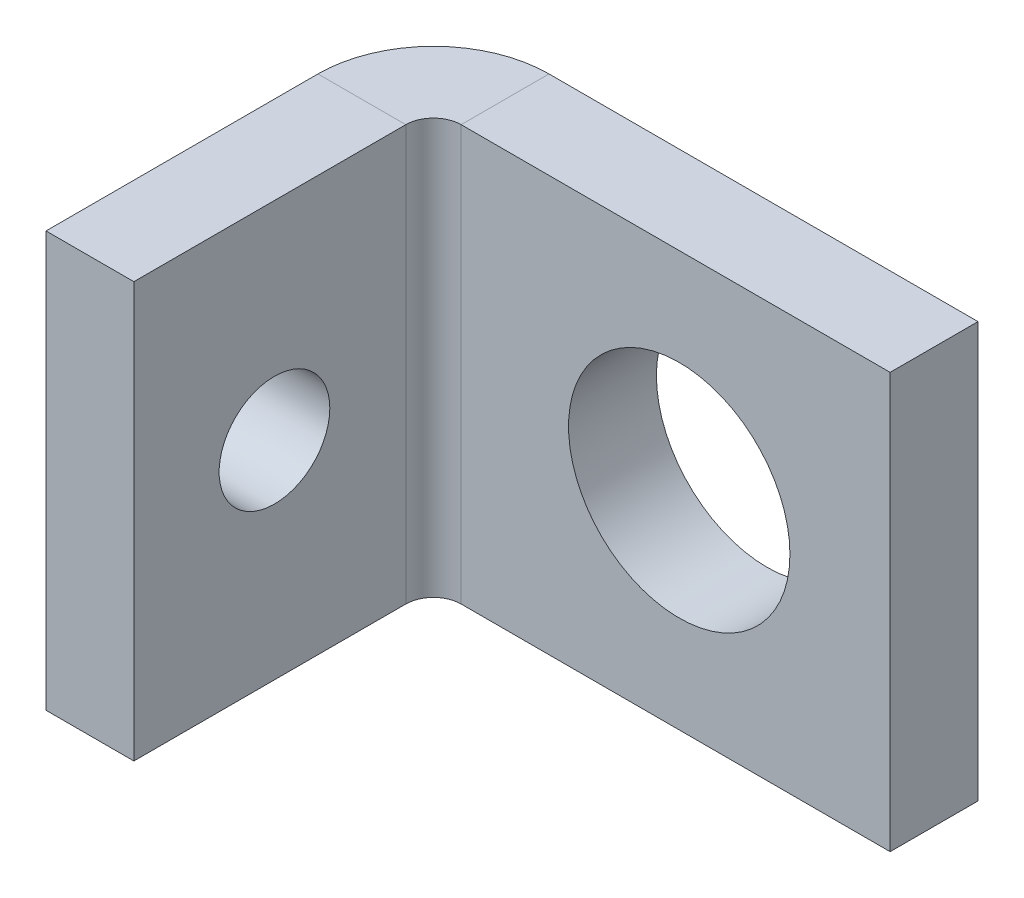
ISO-10303-21;
HEADER;
FILE_DESCRIPTION(('STEP AP214'),'2;1');
FILE_NAME('part.step','',(''),(''),'','','');
FILE_SCHEMA(('AUTOMOTIVE_DESIGN { 1 0 10303 214 1 1 1 1 }'));
ENDSEC;
DATA;
#1=APPLICATION_CONTEXT('core data for automotive mechanical design processes');
#2=APPLICATION_PROTOCOL_DEFINITION('international standard','automotive_design',2000,#1);
#3=PRODUCT_CONTEXT('',#1,'mechanical');
#4=PRODUCT('Part','Part','',(#3));
#5=PRODUCT_RELATED_PRODUCT_CATEGORY('part','',(#4));
#6=PRODUCT_DEFINITION_FORMATION('','',#4);
#7=PRODUCT_DEFINITION_CONTEXT('part definition',#1,'design');
#8=PRODUCT_DEFINITION('design','',#6,#7);
#9=PRODUCT_DEFINITION_SHAPE('','',#8);
#10=(LENGTH_UNIT() NAMED_UNIT(*) SI_UNIT(.MILLI.,.METRE.));
#11=(NAMED_UNIT(*) PLANE_ANGLE_UNIT() SI_UNIT($,.RADIAN.));
#12=(NAMED_UNIT(*) SI_UNIT($,.STERADIAN.) SOLID_ANGLE_UNIT());
#13=UNCERTAINTY_MEASURE_WITH_UNIT(LENGTH_MEASURE(1.E-05),#10,'distance_accuracy_value','');
#14=(GEOMETRIC_REPRESENTATION_CONTEXT(3) GLOBAL_UNCERTAINTY_ASSIGNED_CONTEXT((#13)) GLOBAL_UNIT_ASSIGNED_CONTEXT((#10,
#11,#12)) REPRESENTATION_CONTEXT('',''));
#15=CARTESIAN_POINT('',(0.,0.,0.));
#16=DIRECTION('',(0.,0.,1.));
#17=DIRECTION('',(1.,0.,0.));
#18=AXIS2_PLACEMENT_3D('',#15,#16,#17);
#19=CARTESIAN_POINT('',(-8.25,7.5,3.175));
#20=DIRECTION('',(0.,-1.,0.));
#21=DIRECTION('',(0.,0.,-1.));
#22=AXIS2_PLACEMENT_3D('',#19,#20,#21);
#23=PLANE('',#22);
#24=DIRECTION('',(0.,0.,-1.));
#25=VECTOR('',#24,1.);
#26=CARTESIAN_POINT('',(-7.25,7.5,3.175));
#27=LINE('',#26,#25);
#28=CARTESIAN_POINT('',(-7.25,7.5,3.175));
#29=VERTEX_POINT('',#28);
#30=CARTESIAN_POINT('',(-7.25,7.5,0.));
#31=VERTEX_POINT('',#30);
#32=EDGE_CURVE('E99',#29,#31,#27,.T.);
#33=ORIENTED_EDGE('',*,*,#32,.F.);
#34=DIRECTION('',(-1.,0.,0.));
#35=VECTOR('',#34,1.);
#36=CARTESIAN_POINT('',(-8.25,7.5,3.175));
#37=LINE('',#36,#35);
#38=CARTESIAN_POINT('',(8.25,7.5,3.175));
#39=VERTEX_POINT('',#38);
#40=EDGE_CURVE('E105',#39,#29,#37,.T.);
#41=ORIENTED_EDGE('',*,*,#40,.F.);
#42=DIRECTION('',(0.,0.,-1.));
#43=VECTOR('',#42,1.);
#44=CARTESIAN_POINT('',(8.25,7.5,3.175));
#45=LINE('',#44,#43);
#46=CARTESIAN_POINT('',(8.25,7.5,0.));
#47=VERTEX_POINT('',#46);
#48=EDGE_CURVE('E11',#39,#47,#45,.T.);
#49=ORIENTED_EDGE('',*,*,#48,.T.);
#50=DIRECTION('',(-1.,0.,0.));
#51=VECTOR('',#50,1.);
#52=CARTESIAN_POINT('',(-8.25,7.5,0.));
#53=LINE('',#52,#51);
#54=EDGE_CURVE('E90',#47,#31,#53,.T.);
#55=ORIENTED_EDGE('',*,*,#54,.T.);
#56=EDGE_LOOP('',(#33,#41,#49,#55));
#57=FACE_BOUND('',#56,.T.);
#58=ADVANCED_FACE('F41',(#57),#23,.F.);
#59=CARTESIAN_POINT('',(-8.25,-7.5,3.175));
#60=DIRECTION('',(0.,1.,0.));
#61=DIRECTION('',(0.,0.,1.));
#62=AXIS2_PLACEMENT_3D('',#59,#60,#61);
#63=PLANE('',#62);
#64=DIRECTION('',(0.,0.,-1.));
#65=VECTOR('',#64,1.);
#66=CARTESIAN_POINT('',(-7.25,-7.5,3.175));
#67=LINE('',#66,#65);
#68=CARTESIAN_POINT('',(-7.25,-7.5,3.175));
#69=VERTEX_POINT('',#68);
#70=CARTESIAN_POINT('',(-7.25,-7.5,0.));
#71=VERTEX_POINT('',#70);
#72=EDGE_CURVE('E85',#69,#71,#67,.T.);
#73=ORIENTED_EDGE('',*,*,#72,.T.);
#74=DIRECTION('',(1.,0.,0.));
#75=VECTOR('',#74,1.);
#76=CARTESIAN_POINT('',(-8.25,-7.5,0.));
#77=LINE('',#76,#75);
#78=CARTESIAN_POINT('',(8.25,-7.5,0.));
#79=VERTEX_POINT('',#78);
#80=EDGE_CURVE('E80',#71,#79,#77,.T.);
#81=ORIENTED_EDGE('',*,*,#80,.T.);
#82=DIRECTION('',(0.,0.,-1.));
#83=VECTOR('',#82,1.);
#84=CARTESIAN_POINT('',(8.25,-7.5,3.175));
#85=LINE('',#84,#83);
#86=CARTESIAN_POINT('',(8.25,-7.5,3.175));
#87=VERTEX_POINT('',#86);
#88=EDGE_CURVE('E50',#87,#79,#85,.T.);
#89=ORIENTED_EDGE('',*,*,#88,.F.);
#90=DIRECTION('',(1.,0.,0.));
#91=VECTOR('',#90,1.);
#92=CARTESIAN_POINT('',(-8.25,-7.5,3.175));
#93=LINE('',#92,#91);
#94=EDGE_CURVE('E66',#69,#87,#93,.T.);
#95=ORIENTED_EDGE('',*,*,#94,.F.);
#96=EDGE_LOOP('',(#73,#81,#89,#95));
#97=FACE_BOUND('',#96,.T.);
#98=ADVANCED_FACE('F82',(#97),#63,.F.);
#99=CARTESIAN_POINT('',(0.,0.,3.175));
#100=DIRECTION('',(0.,0.,-1.));
#101=DIRECTION('',(-1.,0.,0.));
#102=AXIS2_PLACEMENT_3D('',#99,#100,#101);
#103=PLANE('',#102);
#104=CARTESIAN_POINT('',(0.630000000000003,0.,3.175));
#105=DIRECTION('',(0.,0.,1.));
#106=DIRECTION('',(1.,0.,0.));
#107=AXIS2_PLACEMENT_3D('',#104,#105,#106);
#108=CIRCLE('',#107,4.);
#109=CARTESIAN_POINT('',(4.63,0.,3.175));
#110=VERTEX_POINT('',#109);
#111=EDGE_CURVE('E161',#110,#110,#108,.T.);
#112=ORIENTED_EDGE('',*,*,#111,.F.);
#113=EDGE_LOOP('',(#112));
#114=FACE_BOUND('',#113,.T.);
#115=DIRECTION('',(0.,-1.,0.));
#116=VECTOR('',#115,1.);
#117=CARTESIAN_POINT('',(-7.25,-7.5,3.175));
#118=LINE('',#117,#116);
#119=EDGE_CURVE('E113',#69,#29,#118,.F.);
#120=ORIENTED_EDGE('',*,*,#119,.F.);
#121=ORIENTED_EDGE('',*,*,#94,.T.);
#122=DIRECTION('',(0.,1.,0.));
#123=VECTOR('',#122,1.);
#124=CARTESIAN_POINT('',(8.25,-7.5,3.175));
#125=LINE('',#124,#123);
#126=EDGE_CURVE('E89',#87,#39,#125,.T.);
#127=ORIENTED_EDGE('',*,*,#126,.T.);
#128=ORIENTED_EDGE('',*,*,#40,.T.);
#129=EDGE_LOOP('',(#120,#121,#127,#128));
#130=FACE_BOUND('',#129,.T.);
#131=ADVANCED_FACE('F222',(#114,#130),#103,.F.);
#132=CARTESIAN_POINT('',(0.,0.,0.));
#133=DIRECTION('',(0.,0.,-1.));
#134=DIRECTION('',(-1.,0.,0.));
#135=AXIS2_PLACEMENT_3D('',#132,#133,#134);
#136=PLANE('',#135);
#137=CARTESIAN_POINT('',(0.630000000000003,0.,0.));
#138=DIRECTION('',(0.,0.,-1.));
#139=DIRECTION('',(-1.,0.,0.));
#140=AXIS2_PLACEMENT_3D('',#137,#138,#139);
#141=CIRCLE('',#140,4.);
#142=CARTESIAN_POINT('',(-3.37,0.,0.));
#143=VERTEX_POINT('',#142);
#144=EDGE_CURVE('E45',#143,#143,#141,.T.);
#145=ORIENTED_EDGE('',*,*,#144,.F.);
#146=EDGE_LOOP('',(#145));
#147=FACE_BOUND('',#146,.T.);
#148=ORIENTED_EDGE('',*,*,#80,.F.);
#149=DIRECTION('',(0.,-1.,0.));
#150=VECTOR('',#149,1.);
#151=CARTESIAN_POINT('',(-7.25,-7.5,0.));
#152=LINE('',#151,#150);
#153=EDGE_CURVE('E123',#71,#31,#152,.F.);
#154=ORIENTED_EDGE('',*,*,#153,.T.);
#155=ORIENTED_EDGE('',*,*,#54,.F.);
#156=DIRECTION('',(0.,1.,0.));
#157=VECTOR('',#156,1.);
#158=CARTESIAN_POINT('',(8.25,-7.5,0.));
#159=LINE('',#158,#157);
#160=EDGE_CURVE('E95',#79,#47,#159,.T.);
#161=ORIENTED_EDGE('',*,*,#160,.F.);
#162=EDGE_LOOP('',(#148,#154,#155,#161));
#163=FACE_BOUND('',#162,.T.);
#164=ADVANCED_FACE('F97',(#147,#163),#136,.T.);
#165=CARTESIAN_POINT('',(8.25,-7.5,3.175));
#166=DIRECTION('',(-1.,0.,0.));
#167=DIRECTION('',(0.,0.,1.));
#168=AXIS2_PLACEMENT_3D('',#165,#166,#167);
#169=PLANE('',#168);
#170=ORIENTED_EDGE('',*,*,#160,.T.);
#171=ORIENTED_EDGE('',*,*,#48,.F.);
#172=ORIENTED_EDGE('',*,*,#126,.F.);
#173=ORIENTED_EDGE('',*,*,#88,.T.);
#174=EDGE_LOOP('',(#170,#171,#172,#173));
#175=FACE_BOUND('',#174,.T.);
#176=ADVANCED_FACE('F43',(#175),#169,.F.);
#177=CARTESIAN_POINT('',(-7.25,7.5,4.175));
#178=DIRECTION('',(0.,1.,0.));
#179=DIRECTION('',(0.,0.,1.));
#180=AXIS2_PLACEMENT_3D('',#177,#178,#179);
#181=PLANE('',#180);
#182=DIRECTION('',(-1.,0.,0.));
#183=VECTOR('',#182,1.);
#184=CARTESIAN_POINT('',(-8.25,7.5,4.17499999999999));
#185=LINE('',#184,#183);
#186=CARTESIAN_POINT('',(-8.25,7.5,4.17499999999999));
#187=VERTEX_POINT('',#186);
#188=CARTESIAN_POINT('',(-11.425,7.5,4.17499999999998));
#189=VERTEX_POINT('',#188);
#190=EDGE_CURVE('E153',#187,#189,#185,.T.);
#191=ORIENTED_EDGE('',*,*,#190,.F.);
#192=CARTESIAN_POINT('',(-7.25,7.5,4.175));
#193=DIRECTION('',(0.,-1.,0.));
#194=DIRECTION('',(0.,0.,-1.));
#195=AXIS2_PLACEMENT_3D('',#192,#193,#194);
#196=CIRCLE('',#195,1.);
#197=EDGE_CURVE('E117',#29,#187,#196,.F.);
#198=ORIENTED_EDGE('',*,*,#197,.F.);
#199=ORIENTED_EDGE('',*,*,#32,.T.);
#200=CARTESIAN_POINT('',(-7.25,7.5,4.175));
#201=DIRECTION('',(0.,-1.,0.));
#202=DIRECTION('',(0.,0.,-1.));
#203=AXIS2_PLACEMENT_3D('',#200,#201,#202);
#204=CIRCLE('',#203,4.175);
#205=EDGE_CURVE('E57',#31,#189,#204,.F.);
#206=ORIENTED_EDGE('',*,*,#205,.T.);
#207=EDGE_LOOP('',(#191,#198,#199,#206));
#208=FACE_BOUND('',#207,.T.);
#209=ADVANCED_FACE('F218',(#208),#181,.T.);
#210=CARTESIAN_POINT('',(-7.25,-7.5,4.175));
#211=DIRECTION('',(0.,1.,0.));
#212=DIRECTION('',(0.,0.,1.));
#213=AXIS2_PLACEMENT_3D('',#210,#211,#212);
#214=PLANE('',#213);
#215=CARTESIAN_POINT('',(-7.25,-7.5,4.175));
#216=DIRECTION('',(0.,-1.,0.));
#217=DIRECTION('',(0.,0.,-1.));
#218=AXIS2_PLACEMENT_3D('',#215,#216,#217);
#219=CIRCLE('',#218,1.);
#220=CARTESIAN_POINT('',(-8.25,-7.5,4.17499999999999));
#221=VERTEX_POINT('',#220);
#222=EDGE_CURVE('E110',#221,#69,#219,.T.);
#223=ORIENTED_EDGE('',*,*,#222,.F.);
#224=DIRECTION('',(-1.,0.,0.));
#225=VECTOR('',#224,1.);
#226=CARTESIAN_POINT('',(-8.25,-7.5,4.17499999999999));
#227=LINE('',#226,#225);
#228=CARTESIAN_POINT('',(-11.425,-7.5,4.17499999999998));
#229=VERTEX_POINT('',#228);
#230=EDGE_CURVE('E152',#221,#229,#227,.T.);
#231=ORIENTED_EDGE('',*,*,#230,.T.);
#232=CARTESIAN_POINT('',(-7.25,-7.5,4.175));
#233=DIRECTION('',(0.,-1.,0.));
#234=DIRECTION('',(0.,0.,-1.));
#235=AXIS2_PLACEMENT_3D('',#232,#233,#234);
#236=CIRCLE('',#235,4.175);
#237=EDGE_CURVE('E120',#229,#71,#236,.T.);
#238=ORIENTED_EDGE('',*,*,#237,.T.);
#239=ORIENTED_EDGE('',*,*,#72,.F.);
#240=EDGE_LOOP('',(#223,#231,#238,#239));
#241=FACE_BOUND('',#240,.T.);
#242=ADVANCED_FACE('F210',(#241),#214,.F.);
#243=CARTESIAN_POINT('',(-7.25,-7.5,4.175));
#244=DIRECTION('',(0.,-1.,0.));
#245=DIRECTION('',(-1.,0.,0.));
#246=AXIS2_PLACEMENT_3D('',#243,#244,#245);
#247=CYLINDRICAL_SURFACE('',#246,4.175);
#248=ORIENTED_EDGE('',*,*,#153,.F.);
#249=ORIENTED_EDGE('',*,*,#237,.F.);
#250=DIRECTION('',(0.,-1.,0.));
#251=VECTOR('',#250,1.);
#252=CARTESIAN_POINT('',(-11.425,0.,4.17499999999998));
#253=LINE('',#252,#251);
#254=EDGE_CURVE('E142',#189,#229,#253,.T.);
#255=ORIENTED_EDGE('',*,*,#254,.F.);
#256=ORIENTED_EDGE('',*,*,#205,.F.);
#257=EDGE_LOOP('',(#248,#249,#255,#256));
#258=FACE_BOUND('',#257,.T.);
#259=ADVANCED_FACE('F214',(#258),#247,.T.);
#260=CARTESIAN_POINT('',(-7.25,-7.5,4.175));
#261=DIRECTION('',(0.,-1.,0.));
#262=DIRECTION('',(-1.,0.,0.));
#263=AXIS2_PLACEMENT_3D('',#260,#261,#262);
#264=CYLINDRICAL_SURFACE('',#263,1.);
#265=ORIENTED_EDGE('',*,*,#119,.T.);
#266=ORIENTED_EDGE('',*,*,#197,.T.);
#267=DIRECTION('',(0.,-1.,0.));
#268=VECTOR('',#267,1.);
#269=CARTESIAN_POINT('',(-8.25,7.5,4.17499999999999));
#270=LINE('',#269,#268);
#271=EDGE_CURVE('E156',#187,#221,#270,.T.);
#272=ORIENTED_EDGE('',*,*,#271,.T.);
#273=ORIENTED_EDGE('',*,*,#222,.T.);
#274=EDGE_LOOP('',(#265,#266,#272,#273));
#275=FACE_BOUND('',#274,.T.);
#276=ADVANCED_FACE('F267',(#275),#264,.F.);
#277=CARTESIAN_POINT('',(-11.425,-7.5,3.17499999999999));
#278=DIRECTION('',(0.,-1.,0.));
#279=DIRECTION('',(0.,0.,-1.));
#280=AXIS2_PLACEMENT_3D('',#277,#278,#279);
#281=PLANE('',#280);
#282=DIRECTION('',(0.,0.,-1.));
#283=VECTOR('',#282,1.);
#284=CARTESIAN_POINT('',(-11.425,-7.5,3.17499999999999));
#285=LINE('',#284,#283);
#286=CARTESIAN_POINT('',(-11.425,-7.5,14.));
#287=VERTEX_POINT('',#286);
#288=EDGE_CURVE('E129',#287,#229,#285,.T.);
#289=ORIENTED_EDGE('',*,*,#288,.T.);
#290=ORIENTED_EDGE('',*,*,#230,.F.);
#291=DIRECTION('',(0.,0.,-1.));
#292=VECTOR('',#291,1.);
#293=CARTESIAN_POINT('',(-8.25,-7.5,3.175));
#294=LINE('',#293,#292);
#295=CARTESIAN_POINT('',(-8.25000000000004,-7.5,14.));
#296=VERTEX_POINT('',#295);
#297=EDGE_CURVE('E132',#296,#221,#294,.T.);
#298=ORIENTED_EDGE('',*,*,#297,.F.);
#299=DIRECTION('',(1.,0.,0.));
#300=VECTOR('',#299,1.);
#301=CARTESIAN_POINT('',(-11.425,-7.5,14.));
#302=LINE('',#301,#300);
#303=EDGE_CURVE('E114',#287,#296,#302,.T.);
#304=ORIENTED_EDGE('',*,*,#303,.F.);
#305=EDGE_LOOP('',(#289,#290,#298,#304));
#306=FACE_BOUND('',#305,.T.);
#307=ADVANCED_FACE('F205',(#306),#281,.T.);
#308=CARTESIAN_POINT('',(-11.425,7.5,14.));
#309=DIRECTION('',(0.,1.,0.));
#310=DIRECTION('',(0.,0.,1.));
#311=AXIS2_PLACEMENT_3D('',#308,#309,#310);
#312=PLANE('',#311);
#313=DIRECTION('',(0.,0.,1.));
#314=VECTOR('',#313,1.);
#315=CARTESIAN_POINT('',(-8.25000000000004,7.5,14.));
#316=LINE('',#315,#314);
#317=CARTESIAN_POINT('',(-8.25000000000004,7.5,14.));
#318=VERTEX_POINT('',#317);
#319=EDGE_CURVE('E139',#187,#318,#316,.T.);
#320=ORIENTED_EDGE('',*,*,#319,.F.);
#321=ORIENTED_EDGE('',*,*,#190,.T.);
#322=DIRECTION('',(0.,0.,1.));
#323=VECTOR('',#322,1.);
#324=CARTESIAN_POINT('',(-11.425,7.5,14.));
#325=LINE('',#324,#323);
#326=CARTESIAN_POINT('',(-11.425,7.5,14.));
#327=VERTEX_POINT('',#326);
#328=EDGE_CURVE('E135',#189,#327,#325,.T.);
#329=ORIENTED_EDGE('',*,*,#328,.T.);
#330=DIRECTION('',(1.,0.,0.));
#331=VECTOR('',#330,1.);
#332=CARTESIAN_POINT('',(-11.425,7.5,14.));
#333=LINE('',#332,#331);
#334=EDGE_CURVE('E126',#327,#318,#333,.T.);
#335=ORIENTED_EDGE('',*,*,#334,.T.);
#336=EDGE_LOOP('',(#320,#321,#329,#335));
#337=FACE_BOUND('',#336,.T.);
#338=ADVANCED_FACE('F192',(#337),#312,.T.);
#339=CARTESIAN_POINT('',(-11.425,0.,0.));
#340=DIRECTION('',(-1.,0.,0.));
#341=DIRECTION('',(0.,0.,1.));
#342=AXIS2_PLACEMENT_3D('',#339,#340,#341);
#343=PLANE('',#342);
#344=CARTESIAN_POINT('',(-11.425,0.,8.92));
#345=DIRECTION('',(-1.,0.,0.));
#346=DIRECTION('',(0.,0.,1.));
#347=AXIS2_PLACEMENT_3D('',#344,#345,#346);
#348=CIRCLE('',#347,2.);
#349=CARTESIAN_POINT('',(-11.425,0.,10.92));
#350=VERTEX_POINT('',#349);
#351=EDGE_CURVE('E164',#350,#350,#348,.T.);
#352=ORIENTED_EDGE('',*,*,#351,.F.);
#353=EDGE_LOOP('',(#352));
#354=FACE_BOUND('',#353,.T.);
#355=ORIENTED_EDGE('',*,*,#328,.F.);
#356=ORIENTED_EDGE('',*,*,#254,.T.);
#357=ORIENTED_EDGE('',*,*,#288,.F.);
#358=DIRECTION('',(0.,-1.,0.));
#359=VECTOR('',#358,1.);
#360=CARTESIAN_POINT('',(-11.425,-7.5,14.));
#361=LINE('',#360,#359);
#362=EDGE_CURVE('E145',#327,#287,#361,.T.);
#363=ORIENTED_EDGE('',*,*,#362,.F.);
#364=EDGE_LOOP('',(#355,#356,#357,#363));
#365=FACE_BOUND('',#364,.T.);
#366=ADVANCED_FACE('F177',(#354,#365),#343,.T.);
#367=CARTESIAN_POINT('',(-8.24999999999999,0.,0.));
#368=DIRECTION('',(-1.,0.,0.));
#369=DIRECTION('',(0.,0.,1.));
#370=AXIS2_PLACEMENT_3D('',#367,#368,#369);
#371=PLANE('',#370);
#372=CARTESIAN_POINT('',(-8.25000000000002,0.,8.92000000000001));
#373=DIRECTION('',(1.,0.,0.));
#374=DIRECTION('',(0.,0.,-1.));
#375=AXIS2_PLACEMENT_3D('',#372,#373,#374);
#376=CIRCLE('',#375,2.);
#377=CARTESIAN_POINT('',(-8.25000000000001,0.,6.92000000000001));
#378=VERTEX_POINT('',#377);
#379=EDGE_CURVE('E167',#378,#378,#376,.T.);
#380=ORIENTED_EDGE('',*,*,#379,.F.);
#381=EDGE_LOOP('',(#380));
#382=FACE_BOUND('',#381,.T.);
#383=ORIENTED_EDGE('',*,*,#271,.F.);
#384=ORIENTED_EDGE('',*,*,#319,.T.);
#385=DIRECTION('',(0.,-1.,0.));
#386=VECTOR('',#385,1.);
#387=CARTESIAN_POINT('',(-8.25000000000004,-7.5,14.));
#388=LINE('',#387,#386);
#389=EDGE_CURVE('E136',#318,#296,#388,.T.);
#390=ORIENTED_EDGE('',*,*,#389,.T.);
#391=ORIENTED_EDGE('',*,*,#297,.T.);
#392=EDGE_LOOP('',(#383,#384,#390,#391));
#393=FACE_BOUND('',#392,.T.);
#394=ADVANCED_FACE('F173',(#382,#393),#371,.F.);
#395=CARTESIAN_POINT('',(-11.425,-7.5,14.));
#396=DIRECTION('',(0.,0.,1.));
#397=DIRECTION('',(1.,0.,0.));
#398=AXIS2_PLACEMENT_3D('',#395,#396,#397);
#399=PLANE('',#398);
#400=ORIENTED_EDGE('',*,*,#389,.F.);
#401=ORIENTED_EDGE('',*,*,#334,.F.);
#402=ORIENTED_EDGE('',*,*,#362,.T.);
#403=ORIENTED_EDGE('',*,*,#303,.T.);
#404=EDGE_LOOP('',(#400,#401,#402,#403));
#405=FACE_BOUND('',#404,.T.);
#406=ADVANCED_FACE('F176',(#405),#399,.T.);
#407=CARTESIAN_POINT('',(0.630000000000003,0.,-6.825));
#408=DIRECTION('',(0.,0.,1.));
#409=DIRECTION('',(1.,0.,0.));
#410=AXIS2_PLACEMENT_3D('',#407,#408,#409);
#411=CYLINDRICAL_SURFACE('',#410,4.);
#412=ORIENTED_EDGE('',*,*,#144,.T.);
#413=EDGE_LOOP('',(#412));
#414=FACE_BOUND('',#413,.T.);
#415=ORIENTED_EDGE('',*,*,#111,.T.);
#416=EDGE_LOOP('',(#415));
#417=FACE_BOUND('',#416,.T.);
#418=ADVANCED_FACE('F295',(#414,#417),#411,.F.);
#419=CARTESIAN_POINT('',(-18.25,0.,8.91999999999998));
#420=DIRECTION('',(1.,0.,0.));
#421=DIRECTION('',(0.,0.,-1.));
#422=AXIS2_PLACEMENT_3D('',#419,#420,#421);
#423=CYLINDRICAL_SURFACE('',#422,2.);
#424=ORIENTED_EDGE('',*,*,#351,.T.);
#425=EDGE_LOOP('',(#424));
#426=FACE_BOUND('',#425,.T.);
#427=ORIENTED_EDGE('',*,*,#379,.T.);
#428=EDGE_LOOP('',(#427));
#429=FACE_BOUND('',#428,.T.);
#430=ADVANCED_FACE('F171',(#426,#429),#423,.F.);
#431=CLOSED_SHELL('',(#58,#98,#131,#164,#176,#209,#242,#259,#276,#307,#338,#366,#394,#406,#418,#430));
#432=MANIFOLD_SOLID_BREP('B2',#431);
#433=ADVANCED_BREP_SHAPE_REPRESENTATION('',(#18,#432),#14);
#434=SHAPE_DEFINITION_REPRESENTATION(#9,#433);
ENDSEC;
END-ISO-10303-21;
